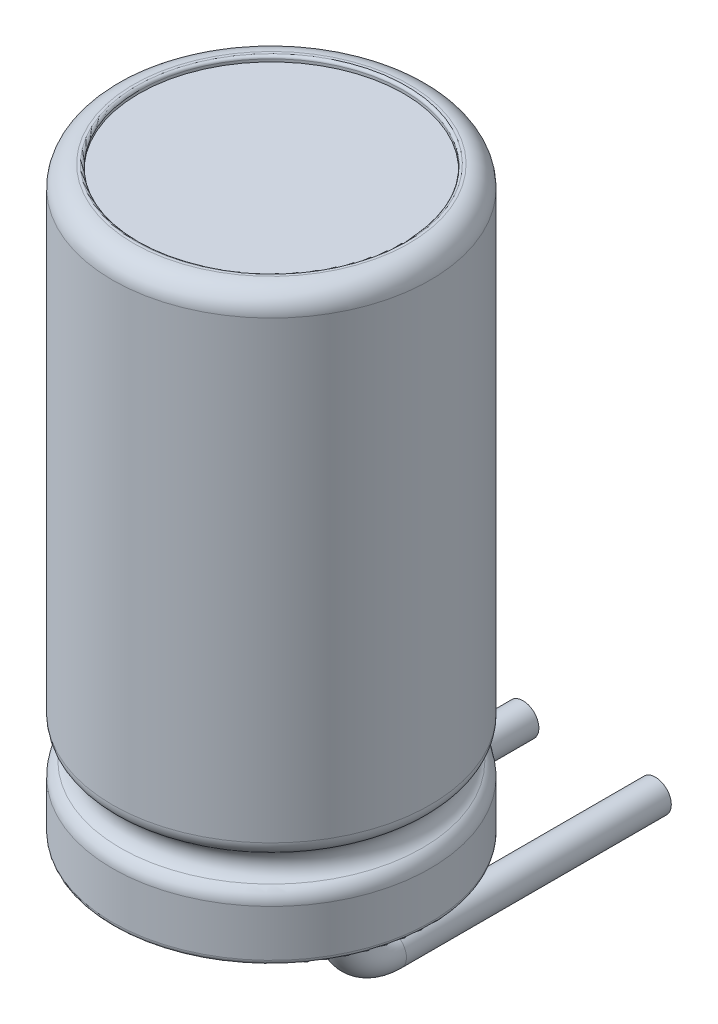
ISO-10303-21;
HEADER;
FILE_DESCRIPTION(('STEP AP214'),'2;1');
FILE_NAME('part.step','',(''),(''),'','','');
FILE_SCHEMA(('AUTOMOTIVE_DESIGN { 1 0 10303 214 1 1 1 1 }'));
ENDSEC;
DATA;
#1=APPLICATION_CONTEXT('core data for automotive mechanical design processes');
#2=APPLICATION_PROTOCOL_DEFINITION('international standard','automotive_design',2000,#1);
#3=PRODUCT_CONTEXT('',#1,'mechanical');
#4=PRODUCT('Part','Part','',(#3));
#5=PRODUCT_RELATED_PRODUCT_CATEGORY('part','',(#4));
#6=PRODUCT_DEFINITION_FORMATION('','',#4);
#7=PRODUCT_DEFINITION_CONTEXT('part definition',#1,'design');
#8=PRODUCT_DEFINITION('design','',#6,#7);
#9=PRODUCT_DEFINITION_SHAPE('','',#8);
#10=(LENGTH_UNIT() NAMED_UNIT(*) SI_UNIT(.MILLI.,.METRE.));
#11=(NAMED_UNIT(*) PLANE_ANGLE_UNIT() SI_UNIT($,.RADIAN.));
#12=(NAMED_UNIT(*) SI_UNIT($,.STERADIAN.) SOLID_ANGLE_UNIT());
#13=UNCERTAINTY_MEASURE_WITH_UNIT(LENGTH_MEASURE(1.E-05),#10,'distance_accuracy_value','');
#14=(GEOMETRIC_REPRESENTATION_CONTEXT(3) GLOBAL_UNCERTAINTY_ASSIGNED_CONTEXT((#13)) GLOBAL_UNIT_ASSIGNED_CONTEXT((#10,
#11,#12)) REPRESENTATION_CONTEXT('',''));
#15=CARTESIAN_POINT('',(0.,0.,0.));
#16=DIRECTION('',(0.,0.,1.));
#17=DIRECTION('',(1.,0.,0.));
#18=AXIS2_PLACEMENT_3D('',#15,#16,#17);
#19=CARTESIAN_POINT('',(1.25,0.3,0.));
#20=DIRECTION('',(0.,-1.,0.));
#21=DIRECTION('',(0.,0.,-1.));
#22=AXIS2_PLACEMENT_3D('',#19,#20,#21);
#23=PLANE('',#22);
#24=CARTESIAN_POINT('',(1.25,0.3,0.));
#25=DIRECTION('',(0.,1.,0.));
#26=DIRECTION('',(0.,0.,-1.));
#27=AXIS2_PLACEMENT_3D('',#24,#25,#26);
#28=CIRCLE('',#27,0.3);
#29=CARTESIAN_POINT('',(1.25,0.3,-0.3));
#30=VERTEX_POINT('',#29);
#31=EDGE_CURVE('E62',#30,#30,#28,.T.);
#32=ORIENTED_EDGE('',*,*,#31,.T.);
#33=EDGE_LOOP('',(#32));
#34=FACE_BOUND('',#33,.T.);
#35=ADVANCED_FACE('F50',(#34),#23,.F.);
#36=CARTESIAN_POINT('',(1.25,-1.7,-6.));
#37=DIRECTION('',(0.,0.,-1.));
#38=DIRECTION('',(0.,1.,0.));
#39=AXIS2_PLACEMENT_3D('',#36,#37,#38);
#40=PLANE('',#39);
#41=CARTESIAN_POINT('',(1.25,-1.7,-6.));
#42=DIRECTION('',(0.,0.,1.));
#43=DIRECTION('',(0.,1.,0.));
#44=AXIS2_PLACEMENT_3D('',#41,#42,#43);
#45=CIRCLE('',#44,0.3);
#46=CARTESIAN_POINT('',(1.25,-1.4,-6.));
#47=VERTEX_POINT('',#46);
#48=EDGE_CURVE('E12',#47,#47,#45,.T.);
#49=ORIENTED_EDGE('',*,*,#48,.F.);
#50=EDGE_LOOP('',(#49));
#51=FACE_BOUND('',#50,.T.);
#52=ADVANCED_FACE('F68',(#51),#40,.T.);
#53=CARTESIAN_POINT('',(1.25,0.3,0.));
#54=DIRECTION('',(0.,-1.,0.));
#55=DIRECTION('',(0.,0.,-1.));
#56=AXIS2_PLACEMENT_3D('',#53,#54,#55);
#57=CYLINDRICAL_SURFACE('',#56,0.3);
#58=CARTESIAN_POINT('',(1.25,-0.699999999999993,0.));
#59=DIRECTION('',(0.,1.,0.));
#60=DIRECTION('',(0.,0.,-1.));
#61=AXIS2_PLACEMENT_3D('',#58,#59,#60);
#62=CIRCLE('',#61,0.3);
#63=CARTESIAN_POINT('',(1.25,-0.699999999999991,0.300000000000002));
#64=VERTEX_POINT('',#63);
#65=EDGE_CURVE('E90',#64,#64,#62,.T.);
#66=ORIENTED_EDGE('',*,*,#65,.T.);
#67=EDGE_LOOP('',(#66));
#68=FACE_BOUND('',#67,.T.);
#69=ORIENTED_EDGE('',*,*,#31,.F.);
#70=EDGE_LOOP('',(#69));
#71=FACE_BOUND('',#70,.T.);
#72=ADVANCED_FACE('F70',(#68,#71),#57,.T.);
#73=CARTESIAN_POINT('',(1.25,-0.7,-1.));
#74=DIRECTION('',(-1.,0.,0.));
#75=DIRECTION('',(0.,0.,-1.));
#76=AXIS2_PLACEMENT_3D('',#73,#74,#75);
#77=TOROIDAL_SURFACE('',#76,1.,0.3);
#78=CARTESIAN_POINT('',(1.25,-1.7,-1.00000000000001));
#79=DIRECTION('',(0.,0.,1.));
#80=DIRECTION('',(0.,1.,0.));
#81=AXIS2_PLACEMENT_3D('',#78,#79,#80);
#82=CIRCLE('',#81,0.3);
#83=CARTESIAN_POINT('',(1.25,-2.,-1.00000000000001));
#84=VERTEX_POINT('',#83);
#85=EDGE_CURVE('E57',#84,#84,#82,.T.);
#86=CARTESIAN_POINT('',(1.25,-0.7,-1.));
#87=DIRECTION('',(-1.,0.,0.));
#88=DIRECTION('',(0.,0.,-1.));
#89=AXIS2_PLACEMENT_3D('',#86,#87,#88);
#90=CIRCLE('',#89,1.3);
#91=EDGE_CURVE('',#84,#64,#90,.T.);
#92=ORIENTED_EDGE('',*,*,#85,.T.);
#93=ORIENTED_EDGE('',*,*,#65,.F.);
#94=ORIENTED_EDGE('',*,*,#91,.T.);
#95=ORIENTED_EDGE('',*,*,#91,.F.);
#96=EDGE_LOOP('',(#92,#94,#93,#95));
#97=FACE_BOUND('',#96,.T.);
#98=ADVANCED_FACE('F75',(#97),#77,.T.);
#99=CARTESIAN_POINT('',(1.25,-1.7,-1.00000000000001));
#100=DIRECTION('',(0.,0.,-1.));
#101=DIRECTION('',(0.,1.,0.));
#102=AXIS2_PLACEMENT_3D('',#99,#100,#101);
#103=CYLINDRICAL_SURFACE('',#102,0.3);
#104=ORIENTED_EDGE('',*,*,#48,.T.);
#105=EDGE_LOOP('',(#104));
#106=FACE_BOUND('',#105,.T.);
#107=ORIENTED_EDGE('',*,*,#85,.F.);
#108=EDGE_LOOP('',(#107));
#109=FACE_BOUND('',#108,.T.);
#110=ADVANCED_FACE('F65',(#106,#109),#103,.T.);
#111=CLOSED_SHELL('',(#35,#52,#72,#98,#110));
#112=MANIFOLD_SOLID_BREP('B2',#111);
#113=CARTESIAN_POINT('',(-1.25,0.3,0.));
#114=DIRECTION('',(0.,-1.,0.));
#115=DIRECTION('',(0.,0.,-1.));
#116=AXIS2_PLACEMENT_3D('',#113,#114,#115);
#117=PLANE('',#116);
#118=CARTESIAN_POINT('',(-1.25,0.3,0.));
#119=DIRECTION('',(0.,-1.,0.));
#120=DIRECTION('',(0.,0.,-1.));
#121=AXIS2_PLACEMENT_3D('',#118,#119,#120);
#122=CIRCLE('',#121,0.3);
#123=CARTESIAN_POINT('',(-1.25,0.3,-0.3));
#124=VERTEX_POINT('',#123);
#125=EDGE_CURVE('E142',#124,#124,#122,.T.);
#126=ORIENTED_EDGE('',*,*,#125,.F.);
#127=EDGE_LOOP('',(#126));
#128=FACE_BOUND('',#127,.T.);
#129=ADVANCED_FACE('F130',(#128),#117,.F.);
#130=CARTESIAN_POINT('',(-1.25,-1.7,-6.));
#131=DIRECTION('',(0.,0.,-1.));
#132=DIRECTION('',(0.,1.,0.));
#133=AXIS2_PLACEMENT_3D('',#130,#131,#132);
#134=PLANE('',#133);
#135=CARTESIAN_POINT('',(-1.25,-1.7,-6.));
#136=DIRECTION('',(0.,0.,-1.));
#137=DIRECTION('',(0.,1.,0.));
#138=AXIS2_PLACEMENT_3D('',#135,#136,#137);
#139=CIRCLE('',#138,0.3);
#140=CARTESIAN_POINT('',(-1.25,-1.4,-6.));
#141=VERTEX_POINT('',#140);
#142=EDGE_CURVE('E48',#141,#141,#139,.T.);
#143=ORIENTED_EDGE('',*,*,#142,.T.);
#144=EDGE_LOOP('',(#143));
#145=FACE_BOUND('',#144,.T.);
#146=ADVANCED_FACE('F145',(#145),#134,.T.);
#147=CARTESIAN_POINT('',(-1.25,0.3,0.));
#148=DIRECTION('',(0.,-1.,0.));
#149=DIRECTION('',(0.,0.,-1.));
#150=AXIS2_PLACEMENT_3D('',#147,#148,#149);
#151=CYLINDRICAL_SURFACE('',#150,0.3);
#152=CARTESIAN_POINT('',(-1.25,-0.699999999999993,0.));
#153=DIRECTION('',(0.,-1.,0.));
#154=DIRECTION('',(0.,0.,-1.));
#155=AXIS2_PLACEMENT_3D('',#152,#153,#154);
#156=CIRCLE('',#155,0.3);
#157=CARTESIAN_POINT('',(-1.25,-0.699999999999991,0.300000000000002));
#158=VERTEX_POINT('',#157);
#159=EDGE_CURVE('E155',#158,#158,#156,.T.);
#160=ORIENTED_EDGE('',*,*,#159,.F.);
#161=EDGE_LOOP('',(#160));
#162=FACE_BOUND('',#161,.T.);
#163=ORIENTED_EDGE('',*,*,#125,.T.);
#164=EDGE_LOOP('',(#163));
#165=FACE_BOUND('',#164,.T.);
#166=ADVANCED_FACE('F160',(#162,#165),#151,.T.);
#167=CARTESIAN_POINT('',(-1.25,-0.7,-1.));
#168=DIRECTION('',(1.,0.,0.));
#169=DIRECTION('',(0.,0.,-1.));
#170=AXIS2_PLACEMENT_3D('',#167,#168,#169);
#171=TOROIDAL_SURFACE('',#170,1.,0.3);
#172=CARTESIAN_POINT('',(-1.25,-1.7,-1.00000000000001));
#173=DIRECTION('',(0.,0.,-1.));
#174=DIRECTION('',(0.,1.,0.));
#175=AXIS2_PLACEMENT_3D('',#172,#173,#174);
#176=CIRCLE('',#175,0.3);
#177=CARTESIAN_POINT('',(-1.25,-2.,-1.00000000000001));
#178=VERTEX_POINT('',#177);
#179=EDGE_CURVE('E137',#178,#178,#176,.T.);
#180=CARTESIAN_POINT('',(-1.25,-0.7,-1.));
#181=DIRECTION('',(1.,0.,0.));
#182=DIRECTION('',(0.,0.,-1.));
#183=AXIS2_PLACEMENT_3D('',#180,#181,#182);
#184=CIRCLE('',#183,1.3);
#185=EDGE_CURVE('',#158,#178,#184,.T.);
#186=ORIENTED_EDGE('',*,*,#159,.T.);
#187=ORIENTED_EDGE('',*,*,#179,.F.);
#188=ORIENTED_EDGE('',*,*,#185,.T.);
#189=ORIENTED_EDGE('',*,*,#185,.F.);
#190=EDGE_LOOP('',(#186,#188,#187,#189));
#191=FACE_BOUND('',#190,.T.);
#192=ADVANCED_FACE('F150',(#191),#171,.T.);
#193=CARTESIAN_POINT('',(-1.25,-1.7,-1.00000000000001));
#194=DIRECTION('',(0.,0.,-1.));
#195=DIRECTION('',(0.,1.,0.));
#196=AXIS2_PLACEMENT_3D('',#193,#194,#195);
#197=CYLINDRICAL_SURFACE('',#196,0.3);
#198=ORIENTED_EDGE('',*,*,#142,.F.);
#199=EDGE_LOOP('',(#198));
#200=FACE_BOUND('',#199,.T.);
#201=ORIENTED_EDGE('',*,*,#179,.T.);
#202=EDGE_LOOP('',(#201));
#203=FACE_BOUND('',#202,.T.);
#204=ADVANCED_FACE('F147',(#200,#203),#197,.T.);
#205=CLOSED_SHELL('',(#129,#146,#166,#192,#204));
#206=MANIFOLD_SOLID_BREP('B6',#205);
#207=CARTESIAN_POINT('',(0.,11.,0.));
#208=DIRECTION('',(0.,-1.,0.));
#209=DIRECTION('',(0.,0.,-1.));
#210=AXIS2_PLACEMENT_3D('',#207,#208,#209);
#211=CYLINDRICAL_SURFACE('',#210,3.);
#212=CARTESIAN_POINT('',(0.,0.980384757729203,0.));
#213=DIRECTION('',(0.,1.,0.));
#214=DIRECTION('',(0.,0.,1.));
#215=AXIS2_PLACEMENT_3D('',#212,#213,#214);
#216=CIRCLE('',#215,3.);
#217=CARTESIAN_POINT('',(0.,0.980384757729203,3.));
#218=VERTEX_POINT('',#217);
#219=EDGE_CURVE('E232',#218,#218,#216,.F.);
#220=ORIENTED_EDGE('',*,*,#219,.T.);
#221=EDGE_LOOP('',(#220));
#222=FACE_BOUND('',#221,.T.);
#223=CARTESIAN_POINT('',(0.,0.0999999999999994,0.));
#224=DIRECTION('',(0.,1.,0.));
#225=DIRECTION('',(0.,0.,1.));
#226=AXIS2_PLACEMENT_3D('',#223,#224,#225);
#227=CIRCLE('',#226,3.);
#228=CARTESIAN_POINT('',(0.,0.0999999999999994,3.));
#229=VERTEX_POINT('',#228);
#230=EDGE_CURVE('E244',#229,#229,#227,.T.);
#231=ORIENTED_EDGE('',*,*,#230,.T.);
#232=EDGE_LOOP('',(#231));
#233=FACE_BOUND('',#232,.T.);
#234=ADVANCED_FACE('F203',(#222,#233),#211,.T.);
#235=CARTESIAN_POINT('',(0.,0.,0.));
#236=DIRECTION('',(0.,1.,0.));
#237=DIRECTION('',(0.,0.,1.));
#238=AXIS2_PLACEMENT_3D('',#235,#236,#237);
#239=PLANE('',#238);
#240=CARTESIAN_POINT('',(0.,0.,0.));
#241=DIRECTION('',(0.,1.,0.));
#242=DIRECTION('',(0.,0.,1.));
#243=AXIS2_PLACEMENT_3D('',#240,#241,#242);
#244=CIRCLE('',#243,2.9);
#245=CARTESIAN_POINT('',(0.,0.,2.9));
#246=VERTEX_POINT('',#245);
#247=EDGE_CURVE('E238',#246,#246,#244,.F.);
#248=ORIENTED_EDGE('',*,*,#247,.T.);
#249=EDGE_LOOP('',(#248));
#250=FACE_BOUND('',#249,.T.);
#251=CARTESIAN_POINT('',(0.,0.,0.));
#252=DIRECTION('',(0.,1.,0.));
#253=DIRECTION('',(0.,0.,1.));
#254=AXIS2_PLACEMENT_3D('',#251,#252,#253);
#255=CIRCLE('',#254,2.6);
#256=CARTESIAN_POINT('',(0.,0.,2.6));
#257=VERTEX_POINT('',#256);
#258=EDGE_CURVE('E241',#257,#257,#255,.T.);
#259=ORIENTED_EDGE('',*,*,#258,.T.);
#260=EDGE_LOOP('',(#259));
#261=FACE_BOUND('',#260,.T.);
#262=ADVANCED_FACE('F270',(#250,#261),#239,.F.);
#263=CARTESIAN_POINT('',(0.,0.3,0.));
#264=DIRECTION('',(0.,-1.,0.));
#265=DIRECTION('',(0.,0.,-1.));
#266=AXIS2_PLACEMENT_3D('',#263,#264,#265);
#267=CYLINDRICAL_SURFACE('',#266,2.5);
#268=CARTESIAN_POINT('',(0.,0.1,0.));
#269=DIRECTION('',(0.,1.,0.));
#270=DIRECTION('',(0.,0.,1.));
#271=AXIS2_PLACEMENT_3D('',#268,#269,#270);
#272=CIRCLE('',#271,2.5);
#273=CARTESIAN_POINT('',(0.,0.1,2.5));
#274=VERTEX_POINT('',#273);
#275=EDGE_CURVE('E235',#274,#274,#272,.F.);
#276=ORIENTED_EDGE('',*,*,#275,.T.);
#277=EDGE_LOOP('',(#276));
#278=FACE_BOUND('',#277,.T.);
#279=CARTESIAN_POINT('',(0.,0.3,0.));
#280=DIRECTION('',(0.,-1.,0.));
#281=DIRECTION('',(0.,0.,-1.));
#282=AXIS2_PLACEMENT_3D('',#279,#280,#281);
#283=CIRCLE('',#282,2.5);
#284=CARTESIAN_POINT('',(0.,0.3,-2.5));
#285=VERTEX_POINT('',#284);
#286=EDGE_CURVE('E247',#285,#285,#283,.T.);
#287=ORIENTED_EDGE('',*,*,#286,.F.);
#288=EDGE_LOOP('',(#287));
#289=FACE_BOUND('',#288,.T.);
#290=ADVANCED_FACE('F276',(#278,#289),#267,.F.);
#291=CARTESIAN_POINT('',(0.,0.3,0.));
#292=DIRECTION('',(0.,-1.,0.));
#293=DIRECTION('',(0.,0.,-1.));
#294=AXIS2_PLACEMENT_3D('',#291,#292,#293);
#295=PLANE('',#294);
#296=ORIENTED_EDGE('',*,*,#286,.T.);
#297=EDGE_LOOP('',(#296));
#298=FACE_BOUND('',#297,.T.);
#299=ADVANCED_FACE('F302',(#298),#295,.T.);
#300=CARTESIAN_POINT('',(0.,1.5,0.));
#301=DIRECTION('',(0.,-1.,0.));
#302=DIRECTION('',(0.,0.,-1.));
#303=AXIS2_PLACEMENT_3D('',#300,#301,#302);
#304=TOROIDAL_SURFACE('',#303,3.,0.3);
#305=CARTESIAN_POINT('',(0.,1.24019237886462,0.));
#306=DIRECTION('',(0.,1.,0.));
#307=DIRECTION('',(0.,0.,1.));
#308=AXIS2_PLACEMENT_3D('',#305,#306,#307);
#309=CIRCLE('',#308,2.85000000000003);
#310=CARTESIAN_POINT('',(0.,1.24019237886462,2.85000000000003));
#311=VERTEX_POINT('',#310);
#312=EDGE_CURVE('E226',#311,#311,#309,.T.);
#313=ORIENTED_EDGE('',*,*,#312,.T.);
#314=EDGE_LOOP('',(#313));
#315=FACE_BOUND('',#314,.T.);
#316=CARTESIAN_POINT('',(0.,1.75980762113538,0.));
#317=DIRECTION('',(0.,-1.,0.));
#318=DIRECTION('',(0.,0.,-1.));
#319=AXIS2_PLACEMENT_3D('',#316,#317,#318);
#320=CIRCLE('',#319,2.85000000000003);
#321=CARTESIAN_POINT('',(0.,1.75980762113538,-2.85000000000003));
#322=VERTEX_POINT('',#321);
#323=EDGE_CURVE('E229',#322,#322,#320,.T.);
#324=ORIENTED_EDGE('',*,*,#323,.T.);
#325=EDGE_LOOP('',(#324));
#326=FACE_BOUND('',#325,.T.);
#327=ADVANCED_FACE('F266',(#315,#326),#304,.F.);
#328=CARTESIAN_POINT('',(0.,10.9,0.));
#329=DIRECTION('',(0.,1.,0.));
#330=DIRECTION('',(0.,0.,1.));
#331=AXIS2_PLACEMENT_3D('',#328,#329,#330);
#332=PLANE('',#331);
#333=CARTESIAN_POINT('',(0.,10.9,0.));
#334=DIRECTION('',(0.,1.,0.));
#335=DIRECTION('',(0.,0.,1.));
#336=AXIS2_PLACEMENT_3D('',#333,#334,#335);
#337=CIRCLE('',#336,2.5);
#338=CARTESIAN_POINT('',(0.,10.9,2.5));
#339=VERTEX_POINT('',#338);
#340=EDGE_CURVE('E250',#339,#339,#337,.T.);
#341=ORIENTED_EDGE('',*,*,#340,.T.);
#342=EDGE_LOOP('',(#341));
#343=FACE_BOUND('',#342,.T.);
#344=ADVANCED_FACE('F254',(#343),#332,.T.);
#345=CARTESIAN_POINT('',(0.,10.9,0.));
#346=DIRECTION('',(0.,1.,0.));
#347=DIRECTION('',(0.,0.,1.));
#348=AXIS2_PLACEMENT_3D('',#345,#346,#347);
#349=CYLINDRICAL_SURFACE('',#348,2.5);
#350=CARTESIAN_POINT('',(0.,10.95,0.));
#351=DIRECTION('',(0.,1.,0.));
#352=DIRECTION('',(0.,0.,1.));
#353=AXIS2_PLACEMENT_3D('',#350,#351,#352);
#354=CIRCLE('',#353,2.5);
#355=CARTESIAN_POINT('',(0.,10.95,2.5));
#356=VERTEX_POINT('',#355);
#357=EDGE_CURVE('E210',#356,#356,#354,.T.);
#358=ORIENTED_EDGE('',*,*,#357,.T.);
#359=EDGE_LOOP('',(#358));
#360=FACE_BOUND('',#359,.T.);
#361=ORIENTED_EDGE('',*,*,#340,.F.);
#362=EDGE_LOOP('',(#361));
#363=FACE_BOUND('',#362,.T.);
#364=ADVANCED_FACE('F256',(#360,#363),#349,.F.);
#365=CARTESIAN_POINT('',(0.,11.,0.));
#366=DIRECTION('',(0.,1.,0.));
#367=DIRECTION('',(0.,0.,1.));
#368=AXIS2_PLACEMENT_3D('',#365,#366,#367);
#369=PLANE('',#368);
#370=CARTESIAN_POINT('',(0.,11.,0.));
#371=DIRECTION('',(0.,1.,0.));
#372=DIRECTION('',(0.,0.,1.));
#373=AXIS2_PLACEMENT_3D('',#370,#371,#372);
#374=CIRCLE('',#373,2.55);
#375=CARTESIAN_POINT('',(0.,11.,2.55));
#376=VERTEX_POINT('',#375);
#377=EDGE_CURVE('E129',#376,#376,#374,.F.);
#378=ORIENTED_EDGE('',*,*,#377,.T.);
#379=EDGE_LOOP('',(#378));
#380=FACE_BOUND('',#379,.T.);
#381=CARTESIAN_POINT('',(0.,11.,0.));
#382=DIRECTION('',(0.,1.,0.));
#383=DIRECTION('',(0.,0.,1.));
#384=AXIS2_PLACEMENT_3D('',#381,#382,#383);
#385=CIRCLE('',#384,2.6);
#386=CARTESIAN_POINT('',(0.,11.,2.6));
#387=VERTEX_POINT('',#386);
#388=EDGE_CURVE('E218',#387,#387,#385,.T.);
#389=ORIENTED_EDGE('',*,*,#388,.T.);
#390=EDGE_LOOP('',(#389));
#391=FACE_BOUND('',#390,.T.);
#392=ADVANCED_FACE('F258',(#380,#391),#369,.T.);
#393=CARTESIAN_POINT('',(0.,10.6,0.));
#394=DIRECTION('',(0.,1.,0.));
#395=DIRECTION('',(0.,0.,1.));
#396=AXIS2_PLACEMENT_3D('',#393,#394,#395);
#397=CIRCLE('',#396,3.);
#398=CARTESIAN_POINT('',(0.,10.6,3.));
#399=VERTEX_POINT('',#398);
#400=EDGE_CURVE('E214',#399,#399,#397,.F.);
#401=ORIENTED_EDGE('',*,*,#400,.T.);
#402=EDGE_LOOP('',(#401));
#403=FACE_BOUND('',#402,.T.);
#404=CARTESIAN_POINT('',(0.,2.0196152422708,0.));
#405=DIRECTION('',(0.,1.,0.));
#406=DIRECTION('',(0.,0.,1.));
#407=AXIS2_PLACEMENT_3D('',#404,#405,#406);
#408=CIRCLE('',#407,3.);
#409=CARTESIAN_POINT('',(0.,2.0196152422708,3.));
#410=VERTEX_POINT('',#409);
#411=EDGE_CURVE('E223',#410,#410,#408,.T.);
#412=ORIENTED_EDGE('',*,*,#411,.T.);
#413=EDGE_LOOP('',(#412));
#414=FACE_BOUND('',#413,.T.);
#415=ADVANCED_FACE('F264',(#403,#414),#211,.T.);
#416=CARTESIAN_POINT('',(0.,0.0999999999999994,0.));
#417=DIRECTION('',(0.,1.,0.));
#418=DIRECTION('',(0.,0.,1.));
#419=AXIS2_PLACEMENT_3D('',#416,#417,#418);
#420=TOROIDAL_SURFACE('',#419,2.9,0.1);
#421=ORIENTED_EDGE('',*,*,#247,.F.);
#422=EDGE_LOOP('',(#421));
#423=FACE_BOUND('',#422,.T.);
#424=ORIENTED_EDGE('',*,*,#230,.F.);
#425=EDGE_LOOP('',(#424));
#426=FACE_BOUND('',#425,.T.);
#427=ADVANCED_FACE('F282',(#423,#426),#420,.T.);
#428=CARTESIAN_POINT('',(0.,0.1,0.));
#429=DIRECTION('',(0.,1.,0.));
#430=DIRECTION('',(0.,0.,1.));
#431=AXIS2_PLACEMENT_3D('',#428,#429,#430);
#432=TOROIDAL_SURFACE('',#431,2.6,0.1);
#433=ORIENTED_EDGE('',*,*,#258,.F.);
#434=EDGE_LOOP('',(#433));
#435=FACE_BOUND('',#434,.T.);
#436=ORIENTED_EDGE('',*,*,#275,.F.);
#437=EDGE_LOOP('',(#436));
#438=FACE_BOUND('',#437,.T.);
#439=ADVANCED_FACE('F287',(#435,#438),#432,.T.);
#440=CARTESIAN_POINT('',(0.,0.980384757729204,0.));
#441=DIRECTION('',(0.,1.,0.));
#442=DIRECTION('',(0.,0.,1.));
#443=AXIS2_PLACEMENT_3D('',#440,#441,#442);
#444=TOROIDAL_SURFACE('',#443,2.70000000000005,0.3);
#445=ORIENTED_EDGE('',*,*,#312,.F.);
#446=EDGE_LOOP('',(#445));
#447=FACE_BOUND('',#446,.T.);
#448=ORIENTED_EDGE('',*,*,#219,.F.);
#449=EDGE_LOOP('',(#448));
#450=FACE_BOUND('',#449,.T.);
#451=ADVANCED_FACE('F297',(#447,#450),#444,.T.);
#452=CARTESIAN_POINT('',(0.,2.0196152422708,0.));
#453=DIRECTION('',(0.,1.,0.));
#454=DIRECTION('',(0.,0.,1.));
#455=AXIS2_PLACEMENT_3D('',#452,#453,#454);
#456=TOROIDAL_SURFACE('',#455,2.70000000000005,0.3);
#457=ORIENTED_EDGE('',*,*,#411,.F.);
#458=EDGE_LOOP('',(#457));
#459=FACE_BOUND('',#458,.T.);
#460=ORIENTED_EDGE('',*,*,#323,.F.);
#461=EDGE_LOOP('',(#460));
#462=FACE_BOUND('',#461,.T.);
#463=ADVANCED_FACE('F293',(#459,#462),#456,.T.);
#464=CARTESIAN_POINT('',(0.,10.6,0.));
#465=DIRECTION('',(0.,1.,0.));
#466=DIRECTION('',(0.,0.,1.));
#467=AXIS2_PLACEMENT_3D('',#464,#465,#466);
#468=TOROIDAL_SURFACE('',#467,2.6,0.4);
#469=ORIENTED_EDGE('',*,*,#400,.F.);
#470=EDGE_LOOP('',(#469));
#471=FACE_BOUND('',#470,.T.);
#472=ORIENTED_EDGE('',*,*,#388,.F.);
#473=EDGE_LOOP('',(#472));
#474=FACE_BOUND('',#473,.T.);
#475=ADVANCED_FACE('F296',(#471,#474),#468,.T.);
#476=CARTESIAN_POINT('',(0.,10.95,0.));
#477=DIRECTION('',(0.,1.,0.));
#478=DIRECTION('',(0.,0.,1.));
#479=AXIS2_PLACEMENT_3D('',#476,#477,#478);
#480=TOROIDAL_SURFACE('',#479,2.55,0.05);
#481=ORIENTED_EDGE('',*,*,#377,.F.);
#482=EDGE_LOOP('',(#481));
#483=FACE_BOUND('',#482,.T.);
#484=ORIENTED_EDGE('',*,*,#357,.F.);
#485=EDGE_LOOP('',(#484));
#486=FACE_BOUND('',#485,.T.);
#487=ADVANCED_FACE('F205',(#483,#486),#480,.T.);
#488=CLOSED_SHELL('',(#234,#262,#290,#299,#327,#344,#364,#392,#415,#427,#439,#451,#463,#475,#487));
#489=MANIFOLD_SOLID_BREP('B42',#488);
#490=ADVANCED_BREP_SHAPE_REPRESENTATION('',(#18,#112,#206,#489),#14);
#491=SHAPE_DEFINITION_REPRESENTATION(#9,#490);
ENDSEC;
END-ISO-10303-21;
